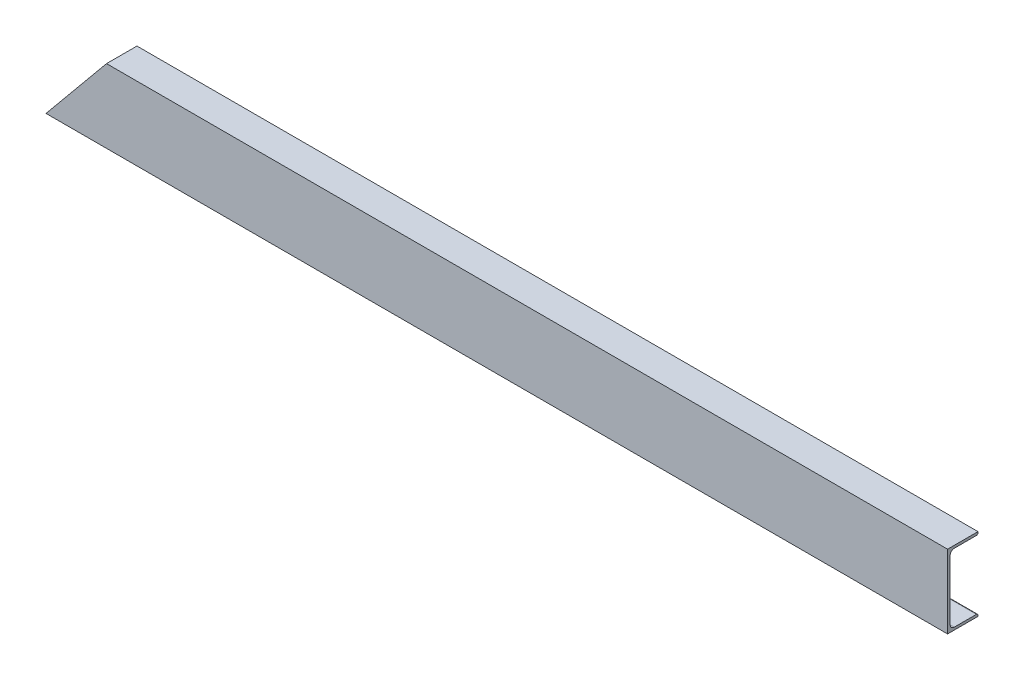
ISO-10303-21;
HEADER;
FILE_DESCRIPTION(('STEP AP214'),'2;1');
FILE_NAME('part.step','',(''),(''),'','','');
FILE_SCHEMA(('AUTOMOTIVE_DESIGN { 1 0 10303 214 1 1 1 1 }'));
ENDSEC;
DATA;
#1=APPLICATION_CONTEXT('core data for automotive mechanical design processes');
#2=APPLICATION_PROTOCOL_DEFINITION('international standard','automotive_design',2000,#1);
#3=PRODUCT_CONTEXT('',#1,'mechanical');
#4=PRODUCT('Part','Part','',(#3));
#5=PRODUCT_RELATED_PRODUCT_CATEGORY('part','',(#4));
#6=PRODUCT_DEFINITION_FORMATION('','',#4);
#7=PRODUCT_DEFINITION_CONTEXT('part definition',#1,'design');
#8=PRODUCT_DEFINITION('design','',#6,#7);
#9=PRODUCT_DEFINITION_SHAPE('','',#8);
#10=(LENGTH_UNIT() NAMED_UNIT(*) SI_UNIT(.MILLI.,.METRE.));
#11=(NAMED_UNIT(*) PLANE_ANGLE_UNIT() SI_UNIT($,.RADIAN.));
#12=(NAMED_UNIT(*) SI_UNIT($,.STERADIAN.) SOLID_ANGLE_UNIT());
#13=UNCERTAINTY_MEASURE_WITH_UNIT(LENGTH_MEASURE(1.E-05),#10,'distance_accuracy_value','');
#14=(GEOMETRIC_REPRESENTATION_CONTEXT(3) GLOBAL_UNCERTAINTY_ASSIGNED_CONTEXT((#13)) GLOBAL_UNIT_ASSIGNED_CONTEXT((#10,
#11,#12)) REPRESENTATION_CONTEXT('',''));
#15=CARTESIAN_POINT('',(0.,0.,0.));
#16=DIRECTION('',(0.,0.,1.));
#17=DIRECTION('',(1.,0.,0.));
#18=AXIS2_PLACEMENT_3D('',#15,#16,#17);
#19=CARTESIAN_POINT('',(1603.56728673064,0.,0.));
#20=DIRECTION('',(0.,-1.,0.));
#21=DIRECTION('',(0.,0.,-1.));
#22=AXIS2_PLACEMENT_3D('',#19,#20,#21);
#23=PLANE('',#22);
#24=DIRECTION('',(0.,0.,1.));
#25=VECTOR('',#24,1.);
#26=CARTESIAN_POINT('',(0.,0.,0.));
#27=LINE('',#26,#25);
#28=CARTESIAN_POINT('',(0.,3.89271948009196E-11,-58.0000000000238));
#29=VERTEX_POINT('',#28);
#30=CARTESIAN_POINT('',(0.,0.,0.));
#31=VERTEX_POINT('',#30);
#32=EDGE_CURVE('E130',#29,#31,#27,.T.);
#33=ORIENTED_EDGE('',*,*,#32,.T.);
#34=DIRECTION('',(-1.,0.,0.));
#35=VECTOR('',#34,1.);
#36=CARTESIAN_POINT('',(1603.56728673064,0.,0.));
#37=LINE('',#36,#35);
#38=CARTESIAN_POINT('',(1603.56728673064,0.,0.));
#39=VERTEX_POINT('',#38);
#40=EDGE_CURVE('E11',#39,#31,#37,.T.);
#41=ORIENTED_EDGE('',*,*,#40,.F.);
#42=DIRECTION('',(0.,0.,1.));
#43=VECTOR('',#42,1.);
#44=CARTESIAN_POINT('',(1603.56728673064,0.,0.));
#45=LINE('',#44,#43);
#46=CARTESIAN_POINT('',(1603.56728673064,0.,-58.));
#47=VERTEX_POINT('',#46);
#48=EDGE_CURVE('E145',#47,#39,#45,.T.);
#49=ORIENTED_EDGE('',*,*,#48,.F.);
#50=DIRECTION('',(-1.,0.,0.));
#51=VECTOR('',#50,1.);
#52=CARTESIAN_POINT('',(1603.56728673064,0.,-58.));
#53=LINE('',#52,#51);
#54=EDGE_CURVE('E144',#47,#29,#53,.T.);
#55=ORIENTED_EDGE('',*,*,#54,.T.);
#56=EDGE_LOOP('',(#33,#41,#49,#55));
#57=FACE_BOUND('',#56,.T.);
#58=ADVANCED_FACE('F37',(#57),#23,.F.);
#59=CARTESIAN_POINT('',(1603.56728673064,-140.,0.));
#60=DIRECTION('',(0.,0.,-1.));
#61=DIRECTION('',(0.,1.,0.));
#62=AXIS2_PLACEMENT_3D('',#59,#60,#61);
#63=PLANE('',#62);
#64=ORIENTED_EDGE('',*,*,#40,.T.);
#65=DIRECTION('',(-0.636154901199819,-0.771561366113836,0.));
#66=VECTOR('',#65,1.);
#67=CARTESIAN_POINT('',(-162.478794091345,-197.062633797496,0.));
#68=LINE('',#67,#66);
#69=CARTESIAN_POINT('',(-115.430463576191,-140.,-2.37587727269783E-11));
#70=VERTEX_POINT('',#69);
#71=EDGE_CURVE('E125',#31,#70,#68,.T.);
#72=ORIENTED_EDGE('',*,*,#71,.T.);
#73=DIRECTION('',(-1.,0.,0.));
#74=VECTOR('',#73,1.);
#75=CARTESIAN_POINT('',(1603.56728673064,-140.,0.));
#76=LINE('',#75,#74);
#77=CARTESIAN_POINT('',(1603.56728673064,-140.,0.));
#78=VERTEX_POINT('',#77);
#79=EDGE_CURVE('E44',#78,#70,#76,.T.);
#80=ORIENTED_EDGE('',*,*,#79,.F.);
#81=DIRECTION('',(0.,-1.,0.));
#82=VECTOR('',#81,1.);
#83=CARTESIAN_POINT('',(1603.56728673064,-140.,0.));
#84=LINE('',#83,#82);
#85=EDGE_CURVE('E140',#39,#78,#84,.T.);
#86=ORIENTED_EDGE('',*,*,#85,.F.);
#87=EDGE_LOOP('',(#64,#72,#80,#86));
#88=FACE_BOUND('',#87,.T.);
#89=ADVANCED_FACE('F139',(#88),#63,.F.);
#90=CARTESIAN_POINT('',(1603.56728673064,-140.,0.));
#91=DIRECTION('',(0.,1.,0.));
#92=DIRECTION('',(0.,0.,1.));
#93=AXIS2_PLACEMENT_3D('',#90,#91,#92);
#94=PLANE('',#93);
#95=ORIENTED_EDGE('',*,*,#79,.T.);
#96=DIRECTION('',(0.,0.,-1.));
#97=VECTOR('',#96,1.);
#98=CARTESIAN_POINT('',(-115.430463576191,-140.,0.));
#99=LINE('',#98,#97);
#100=CARTESIAN_POINT('',(-115.430463576191,-140.,-58.0000000000238));
#101=VERTEX_POINT('',#100);
#102=EDGE_CURVE('E134',#70,#101,#99,.T.);
#103=ORIENTED_EDGE('',*,*,#102,.T.);
#104=DIRECTION('',(-1.,0.,0.));
#105=VECTOR('',#104,1.);
#106=CARTESIAN_POINT('',(1603.56728673064,-140.,-58.));
#107=LINE('',#106,#105);
#108=CARTESIAN_POINT('',(1603.56728673064,-140.,-58.));
#109=VERTEX_POINT('',#108);
#110=EDGE_CURVE('E171',#109,#101,#107,.T.);
#111=ORIENTED_EDGE('',*,*,#110,.F.);
#112=DIRECTION('',(0.,0.,-1.));
#113=VECTOR('',#112,1.);
#114=CARTESIAN_POINT('',(1603.56728673064,-140.,0.));
#115=LINE('',#114,#113);
#116=EDGE_CURVE('E176',#78,#109,#115,.T.);
#117=ORIENTED_EDGE('',*,*,#116,.F.);
#118=EDGE_LOOP('',(#95,#103,#111,#117));
#119=FACE_BOUND('',#118,.T.);
#120=ADVANCED_FACE('F174',(#119),#94,.F.);
#121=CARTESIAN_POINT('',(1603.56728673064,-140.,-58.));
#122=DIRECTION('',(0.,0.,1.));
#123=DIRECTION('',(0.,-1.,0.));
#124=AXIS2_PLACEMENT_3D('',#121,#122,#123);
#125=PLANE('',#124);
#126=ORIENTED_EDGE('',*,*,#110,.T.);
#127=DIRECTION('',(0.636154901199819,0.771561366113836,0.));
#128=VECTOR('',#127,1.);
#129=CARTESIAN_POINT('',(-162.478794091345,-197.062633797496,-58.0000000000004));
#130=LINE('',#129,#128);
#131=CARTESIAN_POINT('',(-113.8639072848,-138.1,-58.0000000000238));
#132=VERTEX_POINT('',#131);
#133=EDGE_CURVE('E216',#101,#132,#130,.T.);
#134=ORIENTED_EDGE('',*,*,#133,.T.);
#135=DIRECTION('',(-1.,0.,0.));
#136=VECTOR('',#135,1.);
#137=CARTESIAN_POINT('',(1603.56728673064,-138.1,-58.));
#138=LINE('',#137,#136);
#139=CARTESIAN_POINT('',(1603.56728673064,-138.1,-58.));
#140=VERTEX_POINT('',#139);
#141=EDGE_CURVE('E169',#140,#132,#138,.T.);
#142=ORIENTED_EDGE('',*,*,#141,.F.);
#143=DIRECTION('',(0.,1.,0.));
#144=VECTOR('',#143,1.);
#145=CARTESIAN_POINT('',(1603.56728673064,-140.,-58.));
#146=LINE('',#145,#144);
#147=EDGE_CURVE('E178',#109,#140,#146,.T.);
#148=ORIENTED_EDGE('',*,*,#147,.F.);
#149=EDGE_LOOP('',(#126,#134,#142,#148));
#150=FACE_BOUND('',#149,.T.);
#151=ADVANCED_FACE('F255',(#150),#125,.F.);
#152=CARTESIAN_POINT('',(1603.56728673064,-138.1,-55.));
#153=DIRECTION('',(-1.,0.,0.));
#154=DIRECTION('',(0.,0.,1.));
#155=AXIS2_PLACEMENT_3D('',#152,#153,#154);
#156=CYLINDRICAL_SURFACE('',#155,2.99999999999999);
#157=ORIENTED_EDGE('',*,*,#141,.T.);
#158=CARTESIAN_POINT('',(-113.8639072848,-138.1,-55.));
#159=DIRECTION('',(-0.771561366113836,0.636154901199819,0.));
#160=DIRECTION('',(0.636154901199819,0.771561366113836,0.));
#161=AXIS2_PLACEMENT_3D('',#158,#159,#160);
#162=ELLIPSE('',#161,3.88821956587879,2.99999999999999);
#163=CARTESIAN_POINT('',(-111.390397351026,-135.1,-55.));
#164=VERTEX_POINT('',#163);
#165=EDGE_CURVE('E218',#132,#164,#162,.F.);
#166=ORIENTED_EDGE('',*,*,#165,.T.);
#167=DIRECTION('',(-1.,0.,0.));
#168=VECTOR('',#167,1.);
#169=CARTESIAN_POINT('',(1603.56728673064,-135.1,-55.));
#170=LINE('',#169,#168);
#171=CARTESIAN_POINT('',(1603.56728673064,-135.1,-55.));
#172=VERTEX_POINT('',#171);
#173=EDGE_CURVE('E167',#172,#164,#170,.T.);
#174=ORIENTED_EDGE('',*,*,#173,.F.);
#175=CARTESIAN_POINT('',(1603.56728673064,-138.1,-55.));
#176=DIRECTION('',(1.,0.,0.));
#177=DIRECTION('',(0.,0.,-1.));
#178=AXIS2_PLACEMENT_3D('',#175,#176,#177);
#179=CIRCLE('',#178,2.99999999999999);
#180=EDGE_CURVE('E180',#140,#172,#179,.T.);
#181=ORIENTED_EDGE('',*,*,#180,.F.);
#182=EDGE_LOOP('',(#157,#166,#174,#181));
#183=FACE_BOUND('',#182,.T.);
#184=ADVANCED_FACE('F254',(#183),#156,.T.);
#185=CARTESIAN_POINT('',(1603.56728673064,-135.1,-55.));
#186=DIRECTION('',(0.,-1.,0.));
#187=DIRECTION('',(0.,0.,-1.));
#188=AXIS2_PLACEMENT_3D('',#185,#186,#187);
#189=PLANE('',#188);
#190=ORIENTED_EDGE('',*,*,#173,.T.);
#191=DIRECTION('',(0.,0.,1.));
#192=VECTOR('',#191,1.);
#193=CARTESIAN_POINT('',(-111.390397351026,-135.1,-55.0000000000002));
#194=LINE('',#193,#192);
#195=CARTESIAN_POINT('',(-111.390397351025,-135.1,-12.9));
#196=VERTEX_POINT('',#195);
#197=EDGE_CURVE('E222',#164,#196,#194,.T.);
#198=ORIENTED_EDGE('',*,*,#197,.T.);
#199=DIRECTION('',(-1.,0.,0.));
#200=VECTOR('',#199,1.);
#201=CARTESIAN_POINT('',(1603.56728673064,-135.1,-12.9));
#202=LINE('',#201,#200);
#203=CARTESIAN_POINT('',(1603.56728673064,-135.1,-12.9));
#204=VERTEX_POINT('',#203);
#205=EDGE_CURVE('E165',#204,#196,#202,.T.);
#206=ORIENTED_EDGE('',*,*,#205,.F.);
#207=DIRECTION('',(0.,0.,1.));
#208=VECTOR('',#207,1.);
#209=CARTESIAN_POINT('',(1603.56728673064,-135.1,-55.));
#210=LINE('',#209,#208);
#211=EDGE_CURVE('E185',#172,#204,#210,.T.);
#212=ORIENTED_EDGE('',*,*,#211,.F.);
#213=EDGE_LOOP('',(#190,#198,#206,#212));
#214=FACE_BOUND('',#213,.T.);
#215=ADVANCED_FACE('F249',(#214),#189,.F.);
#216=CARTESIAN_POINT('',(1603.56728673064,-127.1,-12.9));
#217=DIRECTION('',(-1.,0.,0.));
#218=DIRECTION('',(0.,0.,1.));
#219=AXIS2_PLACEMENT_3D('',#216,#217,#218);
#220=CYLINDRICAL_SURFACE('',#219,8.);
#221=ORIENTED_EDGE('',*,*,#205,.T.);
#222=CARTESIAN_POINT('',(-104.794370860959,-127.1,-12.9));
#223=DIRECTION('',(-0.771561366113836,0.636154901199819,0.));
#224=DIRECTION('',(0.636154901199819,0.771561366113836,0.));
#225=AXIS2_PLACEMENT_3D('',#222,#223,#224);
#226=ELLIPSE('',#225,10.3685855090102,8.);
#227=CARTESIAN_POINT('',(-104.794370860959,-127.1,-4.89999999999999));
#228=VERTEX_POINT('',#227);
#229=EDGE_CURVE('E228',#196,#228,#226,.T.);
#230=ORIENTED_EDGE('',*,*,#229,.T.);
#231=DIRECTION('',(-1.,0.,0.));
#232=VECTOR('',#231,1.);
#233=CARTESIAN_POINT('',(1603.56728673064,-127.1,-4.89999999999999));
#234=LINE('',#233,#232);
#235=CARTESIAN_POINT('',(1603.56728673064,-127.1,-4.89999999999999));
#236=VERTEX_POINT('',#235);
#237=EDGE_CURVE('E163',#236,#228,#234,.T.);
#238=ORIENTED_EDGE('',*,*,#237,.F.);
#239=CARTESIAN_POINT('',(1603.56728673064,-127.1,-12.9));
#240=DIRECTION('',(-1.,0.,0.));
#241=DIRECTION('',(0.,0.,1.));
#242=AXIS2_PLACEMENT_3D('',#239,#240,#241);
#243=CIRCLE('',#242,8.);
#244=EDGE_CURVE('E187',#204,#236,#243,.T.);
#245=ORIENTED_EDGE('',*,*,#244,.F.);
#246=EDGE_LOOP('',(#221,#230,#238,#245));
#247=FACE_BOUND('',#246,.T.);
#248=ADVANCED_FACE('F244',(#247),#220,.F.);
#249=CARTESIAN_POINT('',(1603.56728673064,-12.9,-4.89999999999999));
#250=DIRECTION('',(0.,0.,1.));
#251=DIRECTION('',(0.,-1.,0.));
#252=AXIS2_PLACEMENT_3D('',#249,#250,#251);
#253=PLANE('',#252);
#254=ORIENTED_EDGE('',*,*,#237,.T.);
#255=DIRECTION('',(0.636154901199819,0.771561366113836,0.));
#256=VECTOR('',#255,1.);
#257=CARTESIAN_POINT('',(-100.093977668904,-121.399121510038,-4.9));
#258=LINE('',#257,#256);
#259=CARTESIAN_POINT('',(-10.6360927152639,-12.9000000000001,-4.89999999999999));
#260=VERTEX_POINT('',#259);
#261=EDGE_CURVE('E231',#228,#260,#258,.T.);
#262=ORIENTED_EDGE('',*,*,#261,.T.);
#263=DIRECTION('',(-1.,0.,0.));
#264=VECTOR('',#263,1.);
#265=CARTESIAN_POINT('',(1603.56728673064,-12.9,-4.89999999999999));
#266=LINE('',#265,#264);
#267=CARTESIAN_POINT('',(1603.56728673064,-12.9,-4.89999999999999));
#268=VERTEX_POINT('',#267);
#269=EDGE_CURVE('E161',#268,#260,#266,.T.);
#270=ORIENTED_EDGE('',*,*,#269,.F.);
#271=DIRECTION('',(0.,1.,0.));
#272=VECTOR('',#271,1.);
#273=CARTESIAN_POINT('',(1603.56728673064,-12.9,-4.89999999999999));
#274=LINE('',#273,#272);
#275=EDGE_CURVE('E189',#236,#268,#274,.T.);
#276=ORIENTED_EDGE('',*,*,#275,.F.);
#277=EDGE_LOOP('',(#254,#262,#270,#276));
#278=FACE_BOUND('',#277,.T.);
#279=ADVANCED_FACE('F239',(#278),#253,.F.);
#280=CARTESIAN_POINT('',(1603.56728673064,-12.9,-12.9));
#281=DIRECTION('',(-1.,0.,0.));
#282=DIRECTION('',(0.,0.,1.));
#283=AXIS2_PLACEMENT_3D('',#280,#281,#282);
#284=CYLINDRICAL_SURFACE('',#283,8.);
#285=ORIENTED_EDGE('',*,*,#269,.T.);
#286=CARTESIAN_POINT('',(-10.6360927152639,-12.9,-12.9));
#287=DIRECTION('',(-0.771561366113836,0.636154901199819,0.));
#288=DIRECTION('',(0.636154901199819,0.771561366113836,0.));
#289=AXIS2_PLACEMENT_3D('',#286,#287,#288);
#290=ELLIPSE('',#289,10.3685855090102,8.);
#291=CARTESIAN_POINT('',(-4.04006622519768,-4.90000000000003,-12.9));
#292=VERTEX_POINT('',#291);
#293=EDGE_CURVE('E212',#260,#292,#290,.T.);
#294=ORIENTED_EDGE('',*,*,#293,.T.);
#295=DIRECTION('',(-1.,0.,0.));
#296=VECTOR('',#295,1.);
#297=CARTESIAN_POINT('',(1603.56728673064,-4.90000000000003,-12.9));
#298=LINE('',#297,#296);
#299=CARTESIAN_POINT('',(1603.56728673064,-4.90000000000003,-12.9));
#300=VERTEX_POINT('',#299);
#301=EDGE_CURVE('E159',#300,#292,#298,.T.);
#302=ORIENTED_EDGE('',*,*,#301,.F.);
#303=CARTESIAN_POINT('',(1603.56728673064,-12.9,-12.9));
#304=DIRECTION('',(-1.,0.,0.));
#305=DIRECTION('',(0.,0.,-1.));
#306=AXIS2_PLACEMENT_3D('',#303,#304,#305);
#307=CIRCLE('',#306,8.);
#308=EDGE_CURVE('E191',#268,#300,#307,.T.);
#309=ORIENTED_EDGE('',*,*,#308,.F.);
#310=EDGE_LOOP('',(#285,#294,#302,#309));
#311=FACE_BOUND('',#310,.T.);
#312=ADVANCED_FACE('F234',(#311),#284,.F.);
#313=CARTESIAN_POINT('',(1603.56728673064,-4.90000000000003,-55.));
#314=DIRECTION('',(0.,1.,0.));
#315=DIRECTION('',(0.,0.,1.));
#316=AXIS2_PLACEMENT_3D('',#313,#314,#315);
#317=PLANE('',#316);
#318=ORIENTED_EDGE('',*,*,#301,.T.);
#319=DIRECTION('',(0.,0.,-1.));
#320=VECTOR('',#319,1.);
#321=CARTESIAN_POINT('',(-4.04006622519768,-4.90000000000003,-55.));
#322=LINE('',#321,#320);
#323=CARTESIAN_POINT('',(-4.04006622519768,-4.90000000000003,-55.));
#324=VERTEX_POINT('',#323);
#325=EDGE_CURVE('E202',#292,#324,#322,.T.);
#326=ORIENTED_EDGE('',*,*,#325,.T.);
#327=DIRECTION('',(-1.,0.,0.));
#328=VECTOR('',#327,1.);
#329=CARTESIAN_POINT('',(1603.56728673064,-4.90000000000003,-55.));
#330=LINE('',#329,#328);
#331=CARTESIAN_POINT('',(1603.56728673064,-4.90000000000003,-55.));
#332=VERTEX_POINT('',#331);
#333=EDGE_CURVE('E157',#332,#324,#330,.T.);
#334=ORIENTED_EDGE('',*,*,#333,.F.);
#335=DIRECTION('',(0.,0.,-1.));
#336=VECTOR('',#335,1.);
#337=CARTESIAN_POINT('',(1603.56728673064,-4.90000000000003,-55.));
#338=LINE('',#337,#336);
#339=EDGE_CURVE('E193',#300,#332,#338,.T.);
#340=ORIENTED_EDGE('',*,*,#339,.F.);
#341=EDGE_LOOP('',(#318,#326,#334,#340));
#342=FACE_BOUND('',#341,.T.);
#343=ADVANCED_FACE('F201',(#342),#317,.F.);
#344=CARTESIAN_POINT('',(1603.56728673064,-1.90000000000003,-55.));
#345=DIRECTION('',(-1.,0.,0.));
#346=DIRECTION('',(0.,0.,1.));
#347=AXIS2_PLACEMENT_3D('',#344,#345,#346);
#348=CYLINDRICAL_SURFACE('',#347,3.);
#349=ORIENTED_EDGE('',*,*,#333,.T.);
#350=CARTESIAN_POINT('',(-1.56655629142285,-1.90000000000003,-55.));
#351=DIRECTION('',(-0.771561366113836,0.636154901199819,0.));
#352=DIRECTION('',(0.636154901199819,0.771561366113836,0.));
#353=AXIS2_PLACEMENT_3D('',#350,#351,#352);
#354=ELLIPSE('',#353,3.88821956587881,3.);
#355=CARTESIAN_POINT('',(-1.56655629142285,-1.90000000000003,-58.));
#356=VERTEX_POINT('',#355);
#357=EDGE_CURVE('E149',#324,#356,#354,.F.);
#358=ORIENTED_EDGE('',*,*,#357,.T.);
#359=DIRECTION('',(-1.,0.,0.));
#360=VECTOR('',#359,1.);
#361=CARTESIAN_POINT('',(1603.56728673064,-1.90000000000003,-58.));
#362=LINE('',#361,#360);
#363=CARTESIAN_POINT('',(1603.56728673064,-1.90000000000003,-58.));
#364=VERTEX_POINT('',#363);
#365=EDGE_CURVE('E155',#364,#356,#362,.T.);
#366=ORIENTED_EDGE('',*,*,#365,.F.);
#367=CARTESIAN_POINT('',(1603.56728673064,-1.90000000000003,-55.));
#368=DIRECTION('',(1.,0.,0.));
#369=DIRECTION('',(0.,0.,1.));
#370=AXIS2_PLACEMENT_3D('',#367,#368,#369);
#371=CIRCLE('',#370,3.);
#372=EDGE_CURVE('E56',#332,#364,#371,.T.);
#373=ORIENTED_EDGE('',*,*,#372,.F.);
#374=EDGE_LOOP('',(#349,#358,#366,#373));
#375=FACE_BOUND('',#374,.T.);
#376=ADVANCED_FACE('F206',(#375),#348,.T.);
#377=CARTESIAN_POINT('',(1603.56728673064,0.,-58.));
#378=DIRECTION('',(0.,0.,1.));
#379=DIRECTION('',(1.,0.,0.));
#380=AXIS2_PLACEMENT_3D('',#377,#378,#379);
#381=PLANE('',#380);
#382=ORIENTED_EDGE('',*,*,#365,.T.);
#383=DIRECTION('',(0.636154901199819,0.771561366113836,0.));
#384=VECTOR('',#383,1.);
#385=CARTESIAN_POINT('',(-93.7622378431805,-113.719661962373,-58.));
#386=LINE('',#385,#384);
#387=EDGE_CURVE('E146',#356,#29,#386,.T.);
#388=ORIENTED_EDGE('',*,*,#387,.T.);
#389=ORIENTED_EDGE('',*,*,#54,.F.);
#390=DIRECTION('',(0.,1.,0.));
#391=VECTOR('',#390,1.);
#392=CARTESIAN_POINT('',(1603.56728673064,0.,-58.));
#393=LINE('',#392,#391);
#394=EDGE_CURVE('E51',#364,#47,#393,.T.);
#395=ORIENTED_EDGE('',*,*,#394,.F.);
#396=EDGE_LOOP('',(#382,#388,#389,#395));
#397=FACE_BOUND('',#396,.T.);
#398=ADVANCED_FACE('F208',(#397),#381,.F.);
#399=CARTESIAN_POINT('',(1603.56728673064,-1.90000000000003,-55.));
#400=DIRECTION('',(-1.,0.,0.));
#401=DIRECTION('',(0.,0.,1.));
#402=AXIS2_PLACEMENT_3D('',#399,#400,#401);
#403=PLANE('',#402);
#404=ORIENTED_EDGE('',*,*,#48,.T.);
#405=ORIENTED_EDGE('',*,*,#85,.T.);
#406=ORIENTED_EDGE('',*,*,#116,.T.);
#407=ORIENTED_EDGE('',*,*,#147,.T.);
#408=ORIENTED_EDGE('',*,*,#180,.T.);
#409=ORIENTED_EDGE('',*,*,#211,.T.);
#410=ORIENTED_EDGE('',*,*,#244,.T.);
#411=ORIENTED_EDGE('',*,*,#275,.T.);
#412=ORIENTED_EDGE('',*,*,#308,.T.);
#413=ORIENTED_EDGE('',*,*,#339,.T.);
#414=ORIENTED_EDGE('',*,*,#372,.T.);
#415=ORIENTED_EDGE('',*,*,#394,.T.);
#416=EDGE_LOOP('',(#404,#405,#406,#407,#408,#409,#410,#411,#412,#413,#414,#415));
#417=FACE_BOUND('',#416,.T.);
#418=ADVANCED_FACE('F196',(#417),#403,.F.);
#419=CARTESIAN_POINT('',(98.2497596718077,119.162359120063,-58.0000000000238));
#420=DIRECTION('',(-0.771561366113836,0.636154901199819,0.));
#421=DIRECTION('',(0.,0.,-1.));
#422=AXIS2_PLACEMENT_3D('',#419,#420,#421);
#423=PLANE('',#422);
#424=ORIENTED_EDGE('',*,*,#325,.F.);
#425=ORIENTED_EDGE('',*,*,#293,.F.);
#426=ORIENTED_EDGE('',*,*,#261,.F.);
#427=ORIENTED_EDGE('',*,*,#229,.F.);
#428=ORIENTED_EDGE('',*,*,#197,.F.);
#429=ORIENTED_EDGE('',*,*,#165,.F.);
#430=ORIENTED_EDGE('',*,*,#133,.F.);
#431=ORIENTED_EDGE('',*,*,#102,.F.);
#432=ORIENTED_EDGE('',*,*,#71,.F.);
#433=ORIENTED_EDGE('',*,*,#32,.F.);
#434=ORIENTED_EDGE('',*,*,#387,.F.);
#435=ORIENTED_EDGE('',*,*,#357,.F.);
#436=EDGE_LOOP('',(#424,#425,#426,#427,#428,#429,#430,#431,#432,#433,#434,#435));
#437=FACE_BOUND('',#436,.T.);
#438=ADVANCED_FACE('F127',(#437),#423,.T.);
#439=CLOSED_SHELL('',(#58,#89,#120,#151,#184,#215,#248,#279,#312,#343,#376,#398,#418,#438));
#440=MANIFOLD_SOLID_BREP('B2',#439);
#441=ADVANCED_BREP_SHAPE_REPRESENTATION('',(#18,#440),#14);
#442=SHAPE_DEFINITION_REPRESENTATION(#9,#441);
ENDSEC;
END-ISO-10303-21;
